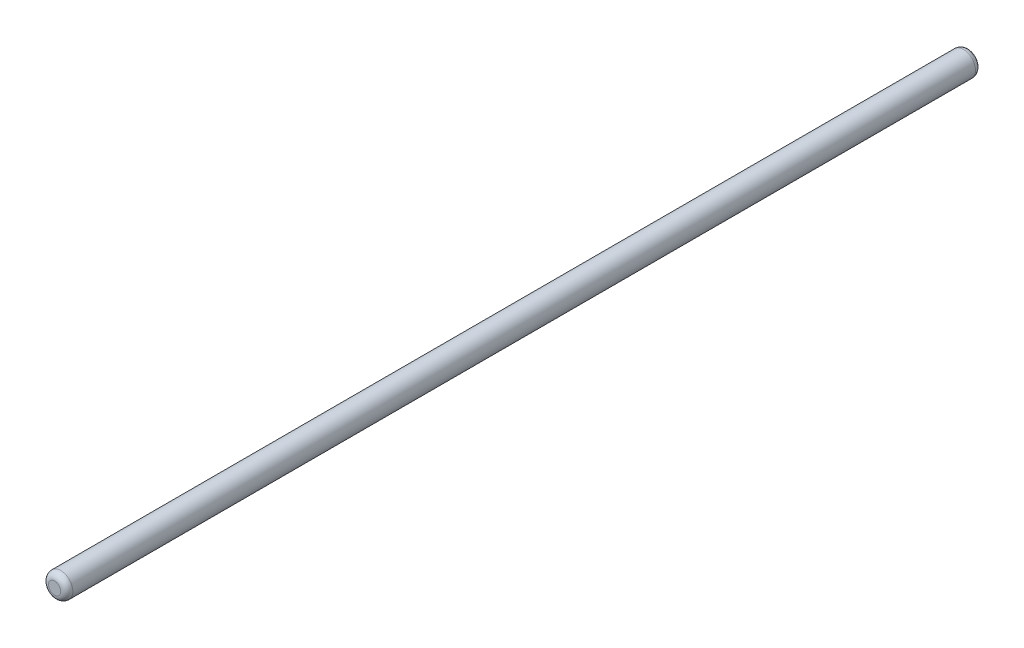
ISO-10303-21;
HEADER;
FILE_DESCRIPTION(('STEP AP214'),'2;1');
FILE_NAME('part.step','',(''),(''),'','','');
FILE_SCHEMA(('AUTOMOTIVE_DESIGN { 1 0 10303 214 1 1 1 1 }'));
ENDSEC;
DATA;
#1=APPLICATION_CONTEXT('core data for automotive mechanical design processes');
#2=APPLICATION_PROTOCOL_DEFINITION('international standard','automotive_design',2000,#1);
#3=PRODUCT_CONTEXT('',#1,'mechanical');
#4=PRODUCT('Part','Part','',(#3));
#5=PRODUCT_RELATED_PRODUCT_CATEGORY('part','',(#4));
#6=PRODUCT_DEFINITION_FORMATION('','',#4);
#7=PRODUCT_DEFINITION_CONTEXT('part definition',#1,'design');
#8=PRODUCT_DEFINITION('design','',#6,#7);
#9=PRODUCT_DEFINITION_SHAPE('','',#8);
#10=(LENGTH_UNIT() NAMED_UNIT(*) SI_UNIT(.MILLI.,.METRE.));
#11=(NAMED_UNIT(*) PLANE_ANGLE_UNIT() SI_UNIT($,.RADIAN.));
#12=(NAMED_UNIT(*) SI_UNIT($,.STERADIAN.) SOLID_ANGLE_UNIT());
#13=UNCERTAINTY_MEASURE_WITH_UNIT(LENGTH_MEASURE(1.E-05),#10,'distance_accuracy_value','');
#14=(GEOMETRIC_REPRESENTATION_CONTEXT(3) GLOBAL_UNCERTAINTY_ASSIGNED_CONTEXT((#13)) GLOBAL_UNIT_ASSIGNED_CONTEXT((#10,
#11,#12)) REPRESENTATION_CONTEXT('',''));
#15=CARTESIAN_POINT('',(0.,0.,0.));
#16=DIRECTION('',(0.,0.,1.));
#17=DIRECTION('',(1.,0.,0.));
#18=AXIS2_PLACEMENT_3D('',#15,#16,#17);
#19=CARTESIAN_POINT('',(0.,0.,300.));
#20=DIRECTION('',(0.,0.,-1.));
#21=DIRECTION('',(-1.,0.,0.));
#22=AXIS2_PLACEMENT_3D('',#19,#20,#21);
#23=CYLINDRICAL_SURFACE('',#22,4.);
#24=CARTESIAN_POINT('',(0.,0.,298.));
#25=DIRECTION('',(0.,0.,1.));
#26=DIRECTION('',(1.,0.,0.));
#27=AXIS2_PLACEMENT_3D('',#24,#25,#26);
#28=CIRCLE('',#27,4.);
#29=CARTESIAN_POINT('',(4.,0.,298.));
#30=VERTEX_POINT('',#29);
#31=EDGE_CURVE('E49',#30,#30,#28,.F.);
#32=ORIENTED_EDGE('',*,*,#31,.T.);
#33=EDGE_LOOP('',(#32));
#34=FACE_BOUND('',#33,.T.);
#35=CARTESIAN_POINT('',(0.,0.,2.));
#36=DIRECTION('',(0.,0.,1.));
#37=DIRECTION('',(1.,0.,0.));
#38=AXIS2_PLACEMENT_3D('',#35,#36,#37);
#39=CIRCLE('',#38,4.);
#40=CARTESIAN_POINT('',(4.,0.,2.));
#41=VERTEX_POINT('',#40);
#42=EDGE_CURVE('E54',#41,#41,#39,.T.);
#43=ORIENTED_EDGE('',*,*,#42,.T.);
#44=EDGE_LOOP('',(#43));
#45=FACE_BOUND('',#44,.T.);
#46=ADVANCED_FACE('F41',(#34,#45),#23,.T.);
#47=CARTESIAN_POINT('',(0.,0.,300.));
#48=DIRECTION('',(0.,0.,1.));
#49=DIRECTION('',(1.,0.,0.));
#50=AXIS2_PLACEMENT_3D('',#47,#48,#49);
#51=PLANE('',#50);
#52=CARTESIAN_POINT('',(0.,0.,300.));
#53=DIRECTION('',(0.,0.,1.));
#54=DIRECTION('',(1.,0.,0.));
#55=AXIS2_PLACEMENT_3D('',#52,#53,#54);
#56=CIRCLE('',#55,2.);
#57=CARTESIAN_POINT('',(2.,0.,300.));
#58=VERTEX_POINT('',#57);
#59=EDGE_CURVE('E59',#58,#58,#56,.T.);
#60=ORIENTED_EDGE('',*,*,#59,.T.);
#61=EDGE_LOOP('',(#60));
#62=FACE_BOUND('',#61,.T.);
#63=ADVANCED_FACE('F66',(#62),#51,.T.);
#64=CARTESIAN_POINT('',(0.,0.,0.));
#65=DIRECTION('',(0.,0.,1.));
#66=DIRECTION('',(1.,0.,0.));
#67=AXIS2_PLACEMENT_3D('',#64,#65,#66);
#68=PLANE('',#67);
#69=CARTESIAN_POINT('',(0.,0.,0.));
#70=DIRECTION('',(0.,0.,1.));
#71=DIRECTION('',(1.,0.,0.));
#72=AXIS2_PLACEMENT_3D('',#69,#70,#71);
#73=CIRCLE('',#72,2.);
#74=CARTESIAN_POINT('',(2.,0.,0.));
#75=VERTEX_POINT('',#74);
#76=EDGE_CURVE('E10',#75,#75,#73,.F.);
#77=ORIENTED_EDGE('',*,*,#76,.T.);
#78=EDGE_LOOP('',(#77));
#79=FACE_BOUND('',#78,.T.);
#80=ADVANCED_FACE('F70',(#79),#68,.F.);
#81=CARTESIAN_POINT('',(0.,0.,298.));
#82=DIRECTION('',(0.,0.,1.));
#83=DIRECTION('',(1.,0.,0.));
#84=AXIS2_PLACEMENT_3D('',#81,#82,#83);
#85=DEGENERATE_TOROIDAL_SURFACE('',#84,2.,2.,.T.);
#86=ORIENTED_EDGE('',*,*,#31,.F.);
#87=EDGE_LOOP('',(#86));
#88=FACE_BOUND('',#87,.T.);
#89=ORIENTED_EDGE('',*,*,#59,.F.);
#90=EDGE_LOOP('',(#89));
#91=FACE_BOUND('',#90,.T.);
#92=ADVANCED_FACE('F68',(#88,#91),#85,.T.);
#93=CARTESIAN_POINT('',(0.,0.,2.));
#94=DIRECTION('',(0.,0.,1.));
#95=DIRECTION('',(1.,0.,0.));
#96=AXIS2_PLACEMENT_3D('',#93,#94,#95);
#97=DEGENERATE_TOROIDAL_SURFACE('',#96,2.,2.,.T.);
#98=ORIENTED_EDGE('',*,*,#76,.F.);
#99=EDGE_LOOP('',(#98));
#100=FACE_BOUND('',#99,.T.);
#101=ORIENTED_EDGE('',*,*,#42,.F.);
#102=EDGE_LOOP('',(#101));
#103=FACE_BOUND('',#102,.T.);
#104=ADVANCED_FACE('F43',(#100,#103),#97,.T.);
#105=CLOSED_SHELL('',(#46,#63,#80,#92,#104));
#106=MANIFOLD_SOLID_BREP('B2',#105);
#107=ADVANCED_BREP_SHAPE_REPRESENTATION('',(#18,#106),#14);
#108=SHAPE_DEFINITION_REPRESENTATION(#9,#107);
ENDSEC;
END-ISO-10303-21;
